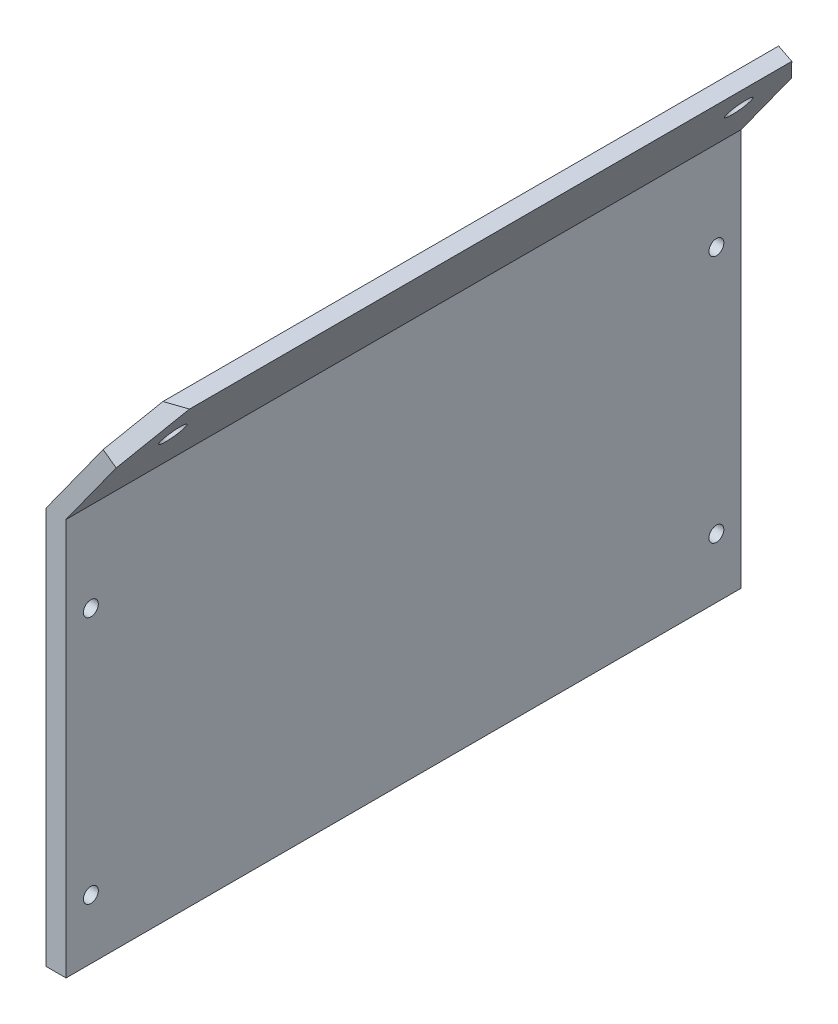
ISO-10303-21;
HEADER;
FILE_DESCRIPTION(('STEP AP214'),'2;1');
FILE_NAME('part.step','',(''),(''),'','','');
FILE_SCHEMA(('AUTOMOTIVE_DESIGN { 1 0 10303 214 1 1 1 1 }'));
ENDSEC;
DATA;
#1=APPLICATION_CONTEXT('core data for automotive mechanical design processes');
#2=APPLICATION_PROTOCOL_DEFINITION('international standard','automotive_design',2000,#1);
#3=PRODUCT_CONTEXT('',#1,'mechanical');
#4=PRODUCT('Part','Part','',(#3));
#5=PRODUCT_RELATED_PRODUCT_CATEGORY('part','',(#4));
#6=PRODUCT_DEFINITION_FORMATION('','',#4);
#7=PRODUCT_DEFINITION_CONTEXT('part definition',#1,'design');
#8=PRODUCT_DEFINITION('design','',#6,#7);
#9=PRODUCT_DEFINITION_SHAPE('','',#8);
#10=(LENGTH_UNIT() NAMED_UNIT(*) SI_UNIT(.MILLI.,.METRE.));
#11=(NAMED_UNIT(*) PLANE_ANGLE_UNIT() SI_UNIT($,.RADIAN.));
#12=(NAMED_UNIT(*) SI_UNIT($,.STERADIAN.) SOLID_ANGLE_UNIT());
#13=UNCERTAINTY_MEASURE_WITH_UNIT(LENGTH_MEASURE(1.E-05),#10,'distance_accuracy_value','');
#14=(GEOMETRIC_REPRESENTATION_CONTEXT(3) GLOBAL_UNCERTAINTY_ASSIGNED_CONTEXT((#13)) GLOBAL_UNIT_ASSIGNED_CONTEXT((#10,
#11,#12)) REPRESENTATION_CONTEXT('',''));
#15=CARTESIAN_POINT('',(0.,0.,0.));
#16=DIRECTION('',(0.,0.,1.));
#17=DIRECTION('',(1.,0.,0.));
#18=AXIS2_PLACEMENT_3D('',#15,#16,#17);
#19=CARTESIAN_POINT('',(-34.8648669846288,-21.5158492010153,136.));
#20=DIRECTION('',(0.,1.,0.));
#21=DIRECTION('',(0.,0.,1.));
#22=AXIS2_PLACEMENT_3D('',#19,#20,#21);
#23=PLANE('',#22);
#24=DIRECTION('',(1.,0.,0.));
#25=VECTOR('',#24,1.);
#26=CARTESIAN_POINT('',(-34.8648669846288,-21.5158492010153,0.));
#27=LINE('',#26,#25);
#28=CARTESIAN_POINT('',(-38.8648669846288,-21.5158492010153,0.));
#29=VERTEX_POINT('',#28);
#30=CARTESIAN_POINT('',(-34.8648669846288,-21.5158492010153,0.));
#31=VERTEX_POINT('',#30);
#32=EDGE_CURVE('E130',#29,#31,#27,.T.);
#33=ORIENTED_EDGE('',*,*,#32,.T.);
#34=DIRECTION('',(0.,0.,-1.));
#35=VECTOR('',#34,1.);
#36=CARTESIAN_POINT('',(-34.8648669846288,-21.5158492010153,136.));
#37=LINE('',#36,#35);
#38=CARTESIAN_POINT('',(-34.8648669846288,-21.5158492010153,136.));
#39=VERTEX_POINT('',#38);
#40=EDGE_CURVE('E119',#39,#31,#37,.T.);
#41=ORIENTED_EDGE('',*,*,#40,.F.);
#42=DIRECTION('',(1.,0.,0.));
#43=VECTOR('',#42,1.);
#44=CARTESIAN_POINT('',(-34.8648669846288,-21.5158492010153,136.));
#45=LINE('',#44,#43);
#46=CARTESIAN_POINT('',(-38.8648669846288,-21.5158492010153,136.));
#47=VERTEX_POINT('',#46);
#48=EDGE_CURVE('E180',#47,#39,#45,.T.);
#49=ORIENTED_EDGE('',*,*,#48,.F.);
#50=DIRECTION('',(0.,0.,-1.));
#51=VECTOR('',#50,1.);
#52=CARTESIAN_POINT('',(-38.8648669846288,-21.5158492010153,136.));
#53=LINE('',#52,#51);
#54=EDGE_CURVE('E165',#47,#29,#53,.T.);
#55=ORIENTED_EDGE('',*,*,#54,.T.);
#56=EDGE_LOOP('',(#33,#41,#49,#55));
#57=FACE_BOUND('',#56,.T.);
#58=ADVANCED_FACE('F32',(#57),#23,.F.);
#59=CARTESIAN_POINT('',(-34.8648669846288,58.4841507989847,136.));
#60=DIRECTION('',(-1.,0.,0.));
#61=DIRECTION('',(0.,-1.,0.));
#62=AXIS2_PLACEMENT_3D('',#59,#60,#61);
#63=PLANE('',#62);
#64=CARTESIAN_POINT('',(-34.8648669846288,-9.51584920101528,5.));
#65=DIRECTION('',(1.,0.,0.));
#66=DIRECTION('',(0.,1.,0.));
#67=AXIS2_PLACEMENT_3D('',#64,#65,#66);
#68=CIRCLE('',#67,1.5);
#69=CARTESIAN_POINT('',(-34.8648669846288,-8.01584920101528,5.));
#70=VERTEX_POINT('',#69);
#71=EDGE_CURVE('E143',#70,#70,#68,.T.);
#72=ORIENTED_EDGE('',*,*,#71,.F.);
#73=EDGE_LOOP('',(#72));
#74=FACE_BOUND('',#73,.T.);
#75=CARTESIAN_POINT('',(-34.8648669846288,40.4841507989847,5.));
#76=DIRECTION('',(1.,0.,0.));
#77=DIRECTION('',(0.,1.,0.));
#78=AXIS2_PLACEMENT_3D('',#75,#76,#77);
#79=CIRCLE('',#78,1.5);
#80=CARTESIAN_POINT('',(-34.8648669846288,41.9841507989847,5.));
#81=VERTEX_POINT('',#80);
#82=EDGE_CURVE('E139',#81,#81,#79,.T.);
#83=ORIENTED_EDGE('',*,*,#82,.F.);
#84=EDGE_LOOP('',(#83));
#85=FACE_BOUND('',#84,.T.);
#86=CARTESIAN_POINT('',(-34.8648669846288,-9.51584920101529,131.));
#87=DIRECTION('',(1.,0.,0.));
#88=DIRECTION('',(0.,1.,0.));
#89=AXIS2_PLACEMENT_3D('',#86,#87,#88);
#90=CIRCLE('',#89,1.5);
#91=CARTESIAN_POINT('',(-34.8648669846288,-8.01584920101529,131.));
#92=VERTEX_POINT('',#91);
#93=EDGE_CURVE('E135',#92,#92,#90,.T.);
#94=ORIENTED_EDGE('',*,*,#93,.F.);
#95=EDGE_LOOP('',(#94));
#96=FACE_BOUND('',#95,.T.);
#97=CARTESIAN_POINT('',(-34.8648669846288,40.4841507989847,131.));
#98=DIRECTION('',(1.,0.,0.));
#99=DIRECTION('',(0.,1.,0.));
#100=AXIS2_PLACEMENT_3D('',#97,#98,#99);
#101=CIRCLE('',#100,1.5);
#102=CARTESIAN_POINT('',(-34.8648669846288,41.9841507989847,131.));
#103=VERTEX_POINT('',#102);
#104=EDGE_CURVE('E131',#103,#103,#101,.T.);
#105=ORIENTED_EDGE('',*,*,#104,.F.);
#106=EDGE_LOOP('',(#105));
#107=FACE_BOUND('',#106,.T.);
#108=DIRECTION('',(0.,1.,0.));
#109=VECTOR('',#108,1.);
#110=CARTESIAN_POINT('',(-34.8648669846288,58.4841507989847,0.));
#111=LINE('',#110,#109);
#112=CARTESIAN_POINT('',(-34.8648669846288,58.4841507989847,0.));
#113=VERTEX_POINT('',#112);
#114=EDGE_CURVE('E173',#31,#113,#111,.T.);
#115=ORIENTED_EDGE('',*,*,#114,.T.);
#116=DIRECTION('',(0.,0.,-1.));
#117=VECTOR('',#116,1.);
#118=CARTESIAN_POINT('',(-34.8648669846288,58.4841507989847,136.));
#119=LINE('',#118,#117);
#120=CARTESIAN_POINT('',(-34.8648669846288,58.4841507989847,136.));
#121=VERTEX_POINT('',#120);
#122=EDGE_CURVE('E116',#121,#113,#119,.T.);
#123=ORIENTED_EDGE('',*,*,#122,.F.);
#124=DIRECTION('',(0.,1.,0.));
#125=VECTOR('',#124,1.);
#126=CARTESIAN_POINT('',(-34.8648669846288,58.4841507989847,136.));
#127=LINE('',#126,#125);
#128=EDGE_CURVE('E167',#39,#121,#127,.T.);
#129=ORIENTED_EDGE('',*,*,#128,.F.);
#130=ORIENTED_EDGE('',*,*,#40,.T.);
#131=EDGE_LOOP('',(#115,#123,#129,#130));
#132=FACE_BOUND('',#131,.T.);
#133=ADVANCED_FACE('F214',(#74,#85,#96,#107,#132),#63,.F.);
#134=CARTESIAN_POINT('',(-17.3357252092765,82.8301810425296,136.));
#135=DIRECTION('',(-0.811534341451495,0.584304725845076,0.));
#136=DIRECTION('',(-0.584304725845076,-0.811534341451495,0.));
#137=AXIS2_PLACEMENT_3D('',#134,#135,#136);
#138=PLANE('',#137);
#139=CARTESIAN_POINT('',(-24.3473819194174,73.0917689451116,11.));
#140=DIRECTION('',(0.811534341451494,-0.584304725845076,0.));
#141=DIRECTION('',(0.584304725845076,0.811534341451494,0.));
#142=AXIS2_PLACEMENT_3D('',#139,#140,#141);
#143=CIRCLE('',#142,2.5);
#144=CARTESIAN_POINT('',(-22.8866201048047,75.1206047987404,11.));
#145=VERTEX_POINT('',#144);
#146=EDGE_CURVE('E150',#145,#145,#143,.T.);
#147=ORIENTED_EDGE('',*,*,#146,.F.);
#148=EDGE_LOOP('',(#147));
#149=FACE_BOUND('',#148,.T.);
#150=CARTESIAN_POINT('',(-24.3473819194174,73.0917689451116,125.));
#151=DIRECTION('',(0.811534341451494,-0.584304725845076,0.));
#152=DIRECTION('',(0.584304725845076,0.811534341451494,0.));
#153=AXIS2_PLACEMENT_3D('',#150,#151,#152);
#154=CIRCLE('',#153,2.49999999999999);
#155=CARTESIAN_POINT('',(-22.8866201048047,75.1206047987404,125.));
#156=VERTEX_POINT('',#155);
#157=EDGE_CURVE('E147',#156,#156,#154,.T.);
#158=ORIENTED_EDGE('',*,*,#157,.F.);
#159=EDGE_LOOP('',(#158));
#160=FACE_BOUND('',#159,.T.);
#161=DIRECTION('',(0.584304725845076,0.811534341451495,0.));
#162=VECTOR('',#161,1.);
#163=CARTESIAN_POINT('',(-17.3357252092765,82.8301810425296,0.));
#164=LINE('',#163,#162);
#165=CARTESIAN_POINT('',(-24.7633233609447,72.514072498546,0.));
#166=VERTEX_POINT('',#165);
#167=EDGE_CURVE('E111',#113,#166,#164,.T.);
#168=ORIENTED_EDGE('',*,*,#167,.T.);
#169=DIRECTION('',(-0.506022736133139,-0.702809355740471,-0.499999999999996));
#170=VECTOR('',#169,1.);
#171=CARTESIAN_POINT('',(-24.7633233609447,72.514072498546,0.));
#172=LINE('',#171,#170);
#173=CARTESIAN_POINT('',(-17.3357252092765,82.8301810425296,7.33919409276687));
#174=VERTEX_POINT('',#173);
#175=EDGE_CURVE('E45',#174,#166,#172,.T.);
#176=ORIENTED_EDGE('',*,*,#175,.F.);
#177=DIRECTION('',(0.,0.,-1.));
#178=VECTOR('',#177,1.);
#179=CARTESIAN_POINT('',(-17.3357252092765,82.8301810425296,136.));
#180=LINE('',#179,#178);
#181=CARTESIAN_POINT('',(-17.3357252092765,82.8301810425296,128.660805907233));
#182=VERTEX_POINT('',#181);
#183=EDGE_CURVE('E108',#182,#174,#180,.T.);
#184=ORIENTED_EDGE('',*,*,#183,.F.);
#185=DIRECTION('',(0.506022736133139,0.702809355740472,-0.499999999999994));
#186=VECTOR('',#185,1.);
#187=CARTESIAN_POINT('',(-24.7633233609447,72.514072498546,136.));
#188=LINE('',#187,#186);
#189=CARTESIAN_POINT('',(-24.7633233609447,72.514072498546,136.));
#190=VERTEX_POINT('',#189);
#191=EDGE_CURVE('E101',#190,#182,#188,.T.);
#192=ORIENTED_EDGE('',*,*,#191,.F.);
#193=DIRECTION('',(0.584304725845076,0.811534341451495,0.));
#194=VECTOR('',#193,1.);
#195=CARTESIAN_POINT('',(-17.3357252092765,82.8301810425296,136.));
#196=LINE('',#195,#194);
#197=EDGE_CURVE('E158',#121,#190,#196,.T.);
#198=ORIENTED_EDGE('',*,*,#197,.F.);
#199=ORIENTED_EDGE('',*,*,#122,.T.);
#200=EDGE_LOOP('',(#168,#176,#184,#192,#198,#199));
#201=FACE_BOUND('',#200,.T.);
#202=ADVANCED_FACE('F106',(#149,#160,#201),#138,.F.);
#203=CARTESIAN_POINT('',(-21.3357252092765,82.8301810425296,136.));
#204=DIRECTION('',(0.,-1.,0.));
#205=DIRECTION('',(0.,0.,-1.));
#206=AXIS2_PLACEMENT_3D('',#203,#204,#205);
#207=PLANE('',#206);
#208=ORIENTED_EDGE('',*,*,#183,.T.);
#209=DIRECTION('',(-0.947535767279718,0.,-0.319649761028593));
#210=VECTOR('',#209,1.);
#211=CARTESIAN_POINT('',(18.0417097281692,82.8301810425296,19.2737183757123));
#212=LINE('',#211,#210);
#213=CARTESIAN_POINT('',(-21.3357252092765,82.8301810425296,5.98980012974519));
#214=VERTEX_POINT('',#213);
#215=EDGE_CURVE('E93',#174,#214,#212,.T.);
#216=ORIENTED_EDGE('',*,*,#215,.T.);
#217=DIRECTION('',(0.,0.,-1.));
#218=VECTOR('',#217,1.);
#219=CARTESIAN_POINT('',(-21.3357252092765,82.8301810425296,136.));
#220=LINE('',#219,#218);
#221=CARTESIAN_POINT('',(-21.3357252092765,82.8301810425296,130.010199870255));
#222=VERTEX_POINT('',#221);
#223=EDGE_CURVE('E117',#222,#214,#220,.T.);
#224=ORIENTED_EDGE('',*,*,#223,.F.);
#225=DIRECTION('',(0.947535767279718,0.,-0.319649761028592));
#226=VECTOR('',#225,1.);
#227=CARTESIAN_POINT('',(-23.1499133663036,82.8301810425296,130.622213506974));
#228=LINE('',#227,#226);
#229=EDGE_CURVE('E115',#222,#182,#228,.T.);
#230=ORIENTED_EDGE('',*,*,#229,.T.);
#231=EDGE_LOOP('',(#208,#216,#224,#230));
#232=FACE_BOUND('',#231,.T.);
#233=ADVANCED_FACE('F114',(#232),#207,.F.);
#234=CARTESIAN_POINT('',(-38.8648669846288,58.4841507989847,136.));
#235=DIRECTION('',(0.811534341451495,-0.584304725845076,0.));
#236=DIRECTION('',(0.584304725845076,0.811534341451495,0.));
#237=AXIS2_PLACEMENT_3D('',#234,#235,#236);
#238=PLANE('',#237);
#239=CARTESIAN_POINT('',(-26.9817338688379,74.9885023486944,11.));
#240=DIRECTION('',(0.811534341451495,-0.584304725845076,0.));
#241=DIRECTION('',(0.584304725845076,0.811534341451495,0.));
#242=AXIS2_PLACEMENT_3D('',#239,#240,#241);
#243=CIRCLE('',#242,2.5);
#244=CARTESIAN_POINT('',(-25.5209720542252,77.0173382023231,11.));
#245=VERTEX_POINT('',#244);
#246=EDGE_CURVE('E148',#245,#245,#243,.T.);
#247=ORIENTED_EDGE('',*,*,#246,.T.);
#248=EDGE_LOOP('',(#247));
#249=FACE_BOUND('',#248,.T.);
#250=CARTESIAN_POINT('',(-26.9817338688379,74.9885023486944,125.));
#251=DIRECTION('',(0.811534341451495,-0.584304725845076,0.));
#252=DIRECTION('',(0.584304725845076,0.811534341451495,0.));
#253=AXIS2_PLACEMENT_3D('',#250,#251,#252);
#254=CIRCLE('',#253,2.49999999999999);
#255=CARTESIAN_POINT('',(-25.5209720542252,77.0173382023231,125.));
#256=VERTEX_POINT('',#255);
#257=EDGE_CURVE('E144',#256,#256,#254,.T.);
#258=ORIENTED_EDGE('',*,*,#257,.T.);
#259=EDGE_LOOP('',(#258));
#260=FACE_BOUND('',#259,.T.);
#261=ORIENTED_EDGE('',*,*,#223,.T.);
#262=DIRECTION('',(-0.506022736133139,-0.702809355740471,-0.499999999999996));
#263=VECTOR('',#262,1.);
#264=CARTESIAN_POINT('',(-1.58852300900975,110.256850765122,25.5019690405419));
#265=LINE('',#264,#263);
#266=CARTESIAN_POINT('',(-27.3976753103651,74.4108059021287,0.));
#267=VERTEX_POINT('',#266);
#268=EDGE_CURVE('E96',#214,#267,#265,.T.);
#269=ORIENTED_EDGE('',*,*,#268,.T.);
#270=DIRECTION('',(-0.584304725845076,-0.811534341451495,0.));
#271=VECTOR('',#270,1.);
#272=CARTESIAN_POINT('',(-38.8648669846288,58.4841507989847,0.));
#273=LINE('',#272,#271);
#274=CARTESIAN_POINT('',(-38.8648669846288,58.4841507989847,0.));
#275=VERTEX_POINT('',#274);
#276=EDGE_CURVE('E176',#267,#275,#273,.T.);
#277=ORIENTED_EDGE('',*,*,#276,.T.);
#278=DIRECTION('',(0.,0.,-1.));
#279=VECTOR('',#278,1.);
#280=CARTESIAN_POINT('',(-38.8648669846288,58.4841507989847,136.));
#281=LINE('',#280,#279);
#282=CARTESIAN_POINT('',(-38.8648669846288,58.4841507989847,136.));
#283=VERTEX_POINT('',#282);
#284=EDGE_CURVE('E121',#283,#275,#281,.T.);
#285=ORIENTED_EDGE('',*,*,#284,.F.);
#286=DIRECTION('',(-0.584304725845076,-0.811534341451495,0.));
#287=VECTOR('',#286,1.);
#288=CARTESIAN_POINT('',(-38.8648669846288,58.4841507989847,136.));
#289=LINE('',#288,#287);
#290=CARTESIAN_POINT('',(-27.3976753103651,74.4108059021287,136.));
#291=VERTEX_POINT('',#290);
#292=EDGE_CURVE('E155',#291,#283,#289,.T.);
#293=ORIENTED_EDGE('',*,*,#292,.F.);
#294=DIRECTION('',(0.506022736133139,0.702809355740472,-0.499999999999994));
#295=VECTOR('',#294,1.);
#296=CARTESIAN_POINT('',(-35.9980690660629,62.4658145747706,144.498030959458));
#297=LINE('',#296,#295);
#298=EDGE_CURVE('E53',#291,#222,#297,.T.);
#299=ORIENTED_EDGE('',*,*,#298,.T.);
#300=EDGE_LOOP('',(#261,#269,#277,#285,#293,#299));
#301=FACE_BOUND('',#300,.T.);
#302=ADVANCED_FACE('F160',(#249,#260,#301),#238,.F.);
#303=CARTESIAN_POINT('',(-38.8648669846288,-21.5158492010153,136.));
#304=DIRECTION('',(1.,0.,0.));
#305=DIRECTION('',(0.,0.,-1.));
#306=AXIS2_PLACEMENT_3D('',#303,#304,#305);
#307=PLANE('',#306);
#308=CARTESIAN_POINT('',(-38.8648669846288,-9.51584920101528,5.));
#309=DIRECTION('',(1.,0.,0.));
#310=DIRECTION('',(0.,0.,-1.));
#311=AXIS2_PLACEMENT_3D('',#308,#309,#310);
#312=CIRCLE('',#311,1.5);
#313=CARTESIAN_POINT('',(-38.8648669846288,-9.51584920101528,3.5));
#314=VERTEX_POINT('',#313);
#315=EDGE_CURVE('E140',#314,#314,#312,.T.);
#316=ORIENTED_EDGE('',*,*,#315,.T.);
#317=EDGE_LOOP('',(#316));
#318=FACE_BOUND('',#317,.T.);
#319=CARTESIAN_POINT('',(-38.8648669846288,40.4841507989847,5.));
#320=DIRECTION('',(1.,0.,0.));
#321=DIRECTION('',(0.,0.,-1.));
#322=AXIS2_PLACEMENT_3D('',#319,#320,#321);
#323=CIRCLE('',#322,1.5);
#324=CARTESIAN_POINT('',(-38.8648669846288,40.4841507989847,3.5));
#325=VERTEX_POINT('',#324);
#326=EDGE_CURVE('E136',#325,#325,#323,.T.);
#327=ORIENTED_EDGE('',*,*,#326,.T.);
#328=EDGE_LOOP('',(#327));
#329=FACE_BOUND('',#328,.T.);
#330=CARTESIAN_POINT('',(-38.8648669846288,-9.51584920101529,131.));
#331=DIRECTION('',(1.,0.,0.));
#332=DIRECTION('',(0.,0.,-1.));
#333=AXIS2_PLACEMENT_3D('',#330,#331,#332);
#334=CIRCLE('',#333,1.5);
#335=CARTESIAN_POINT('',(-38.8648669846288,-9.51584920101529,129.5));
#336=VERTEX_POINT('',#335);
#337=EDGE_CURVE('E132',#336,#336,#334,.T.);
#338=ORIENTED_EDGE('',*,*,#337,.T.);
#339=EDGE_LOOP('',(#338));
#340=FACE_BOUND('',#339,.T.);
#341=CARTESIAN_POINT('',(-38.8648669846288,40.4841507989847,131.));
#342=DIRECTION('',(1.,0.,0.));
#343=DIRECTION('',(0.,0.,-1.));
#344=AXIS2_PLACEMENT_3D('',#341,#342,#343);
#345=CIRCLE('',#344,1.5);
#346=CARTESIAN_POINT('',(-38.8648669846288,40.4841507989847,129.5));
#347=VERTEX_POINT('',#346);
#348=EDGE_CURVE('E127',#347,#347,#345,.T.);
#349=ORIENTED_EDGE('',*,*,#348,.T.);
#350=EDGE_LOOP('',(#349));
#351=FACE_BOUND('',#350,.T.);
#352=DIRECTION('',(0.,-1.,0.));
#353=VECTOR('',#352,1.);
#354=CARTESIAN_POINT('',(-38.8648669846288,-21.5158492010153,0.));
#355=LINE('',#354,#353);
#356=EDGE_CURVE('E178',#275,#29,#355,.T.);
#357=ORIENTED_EDGE('',*,*,#356,.T.);
#358=ORIENTED_EDGE('',*,*,#54,.F.);
#359=DIRECTION('',(0.,-1.,0.));
#360=VECTOR('',#359,1.);
#361=CARTESIAN_POINT('',(-38.8648669846288,-21.5158492010153,136.));
#362=LINE('',#361,#360);
#363=EDGE_CURVE('E163',#283,#47,#362,.T.);
#364=ORIENTED_EDGE('',*,*,#363,.F.);
#365=ORIENTED_EDGE('',*,*,#284,.T.);
#366=EDGE_LOOP('',(#357,#358,#364,#365));
#367=FACE_BOUND('',#366,.T.);
#368=ADVANCED_FACE('F184',(#318,#329,#340,#351,#367),#307,.F.);
#369=CARTESIAN_POINT('',(-38.8648669846288,-21.5158492010153,136.));
#370=DIRECTION('',(0.,0.,-1.));
#371=DIRECTION('',(-1.,0.,0.));
#372=AXIS2_PLACEMENT_3D('',#369,#370,#371);
#373=PLANE('',#372);
#374=ORIENTED_EDGE('',*,*,#197,.T.);
#375=DIRECTION('',(-0.811534341451494,0.584304725845076,0.));
#376=VECTOR('',#375,1.);
#377=CARTESIAN_POINT('',(10.5369927612892,47.0978448905375,136.));
#378=LINE('',#377,#376);
#379=EDGE_CURVE('E39',#190,#291,#378,.T.);
#380=ORIENTED_EDGE('',*,*,#379,.T.);
#381=ORIENTED_EDGE('',*,*,#292,.T.);
#382=ORIENTED_EDGE('',*,*,#363,.T.);
#383=ORIENTED_EDGE('',*,*,#48,.T.);
#384=ORIENTED_EDGE('',*,*,#128,.T.);
#385=EDGE_LOOP('',(#374,#380,#381,#382,#383,#384));
#386=FACE_BOUND('',#385,.T.);
#387=ADVANCED_FACE('F154',(#386),#373,.F.);
#388=CARTESIAN_POINT('',(-38.8648669846288,-21.5158492010153,0.));
#389=DIRECTION('',(0.,0.,-1.));
#390=DIRECTION('',(-1.,0.,0.));
#391=AXIS2_PLACEMENT_3D('',#388,#389,#390);
#392=PLANE('',#391);
#393=DIRECTION('',(-0.811534341451495,0.584304725845076,0.));
#394=VECTOR('',#393,1.);
#395=CARTESIAN_POINT('',(10.5369927612893,47.0978448905376,0.));
#396=LINE('',#395,#394);
#397=EDGE_CURVE('E11',#166,#267,#396,.T.);
#398=ORIENTED_EDGE('',*,*,#397,.F.);
#399=ORIENTED_EDGE('',*,*,#167,.F.);
#400=ORIENTED_EDGE('',*,*,#114,.F.);
#401=ORIENTED_EDGE('',*,*,#32,.F.);
#402=ORIENTED_EDGE('',*,*,#356,.F.);
#403=ORIENTED_EDGE('',*,*,#276,.F.);
#404=EDGE_LOOP('',(#398,#399,#400,#401,#402,#403));
#405=FACE_BOUND('',#404,.T.);
#406=ADVANCED_FACE('F189',(#405),#392,.T.);
#407=CARTESIAN_POINT('',(-170.864866984629,40.4841507989847,131.));
#408=DIRECTION('',(1.,0.,0.));
#409=DIRECTION('',(0.,1.,0.));
#410=AXIS2_PLACEMENT_3D('',#407,#408,#409);
#411=CYLINDRICAL_SURFACE('',#410,1.5);
#412=ORIENTED_EDGE('',*,*,#104,.T.);
#413=EDGE_LOOP('',(#412));
#414=FACE_BOUND('',#413,.T.);
#415=ORIENTED_EDGE('',*,*,#348,.F.);
#416=EDGE_LOOP('',(#415));
#417=FACE_BOUND('',#416,.T.);
#418=ADVANCED_FACE('F236',(#414,#417),#411,.F.);
#419=CARTESIAN_POINT('',(-170.864866984629,-9.51584920101531,131.));
#420=DIRECTION('',(1.,0.,0.));
#421=DIRECTION('',(0.,1.,0.));
#422=AXIS2_PLACEMENT_3D('',#419,#420,#421);
#423=CYLINDRICAL_SURFACE('',#422,1.5);
#424=ORIENTED_EDGE('',*,*,#93,.T.);
#425=EDGE_LOOP('',(#424));
#426=FACE_BOUND('',#425,.T.);
#427=ORIENTED_EDGE('',*,*,#337,.F.);
#428=EDGE_LOOP('',(#427));
#429=FACE_BOUND('',#428,.T.);
#430=ADVANCED_FACE('F241',(#426,#429),#423,.F.);
#431=CARTESIAN_POINT('',(-170.864866984629,40.4841507989847,5.));
#432=DIRECTION('',(1.,0.,0.));
#433=DIRECTION('',(0.,1.,0.));
#434=AXIS2_PLACEMENT_3D('',#431,#432,#433);
#435=CYLINDRICAL_SURFACE('',#434,1.5);
#436=ORIENTED_EDGE('',*,*,#82,.T.);
#437=EDGE_LOOP('',(#436));
#438=FACE_BOUND('',#437,.T.);
#439=ORIENTED_EDGE('',*,*,#326,.F.);
#440=EDGE_LOOP('',(#439));
#441=FACE_BOUND('',#440,.T.);
#442=ADVANCED_FACE('F245',(#438,#441),#435,.F.);
#443=CARTESIAN_POINT('',(-170.864866984629,-9.51584920101529,5.));
#444=DIRECTION('',(1.,0.,0.));
#445=DIRECTION('',(0.,1.,0.));
#446=AXIS2_PLACEMENT_3D('',#443,#444,#445);
#447=CYLINDRICAL_SURFACE('',#446,1.5);
#448=ORIENTED_EDGE('',*,*,#71,.T.);
#449=EDGE_LOOP('',(#448));
#450=FACE_BOUND('',#449,.T.);
#451=ORIENTED_EDGE('',*,*,#315,.F.);
#452=EDGE_LOOP('',(#451));
#453=FACE_BOUND('',#452,.T.);
#454=ADVANCED_FACE('F249',(#450,#453),#447,.F.);
#455=CARTESIAN_POINT('',(-134.716052356821,152.557211660042,125.));
#456=DIRECTION('',(0.811534341451494,-0.584304725845076,0.));
#457=DIRECTION('',(0.584304725845076,0.811534341451494,0.));
#458=AXIS2_PLACEMENT_3D('',#455,#456,#457);
#459=CYLINDRICAL_SURFACE('',#458,2.49999999999999);
#460=ORIENTED_EDGE('',*,*,#157,.T.);
#461=EDGE_LOOP('',(#460));
#462=FACE_BOUND('',#461,.T.);
#463=ORIENTED_EDGE('',*,*,#257,.F.);
#464=EDGE_LOOP('',(#463));
#465=FACE_BOUND('',#464,.T.);
#466=ADVANCED_FACE('F253',(#462,#465),#459,.F.);
#467=CARTESIAN_POINT('',(-134.716052356821,152.557211660042,11.));
#468=DIRECTION('',(0.811534341451494,-0.584304725845076,0.));
#469=DIRECTION('',(0.584304725845076,0.811534341451494,0.));
#470=AXIS2_PLACEMENT_3D('',#467,#468,#469);
#471=CYLINDRICAL_SURFACE('',#470,2.5);
#472=ORIENTED_EDGE('',*,*,#146,.T.);
#473=EDGE_LOOP('',(#472));
#474=FACE_BOUND('',#473,.T.);
#475=ORIENTED_EDGE('',*,*,#246,.F.);
#476=EDGE_LOOP('',(#475));
#477=FACE_BOUND('',#476,.T.);
#478=ADVANCED_FACE('F257',(#474,#477),#471,.F.);
#479=CARTESIAN_POINT('',(-135.131993798348,151.979515213476,136.));
#480=DIRECTION('',(-0.292152362922535,-0.405767170725743,-0.866025403784442));
#481=DIRECTION('',(0.,0.905532152528378,-0.424277645813826));
#482=AXIS2_PLACEMENT_3D('',#479,#480,#481);
#483=PLANE('',#482);
#484=ORIENTED_EDGE('',*,*,#298,.F.);
#485=ORIENTED_EDGE('',*,*,#379,.F.);
#486=ORIENTED_EDGE('',*,*,#191,.T.);
#487=ORIENTED_EDGE('',*,*,#229,.F.);
#488=EDGE_LOOP('',(#484,#485,#486,#487));
#489=FACE_BOUND('',#488,.T.);
#490=ADVANCED_FACE('F211',(#489),#483,.F.);
#491=CARTESIAN_POINT('',(-135.131993798348,151.979515213476,0.));
#492=DIRECTION('',(-0.292152362922536,-0.405767170725744,0.866025403784441));
#493=DIRECTION('',(0.,-0.905532152528377,-0.424277645813828));
#494=AXIS2_PLACEMENT_3D('',#491,#492,#493);
#495=PLANE('',#494);
#496=ORIENTED_EDGE('',*,*,#175,.T.);
#497=ORIENTED_EDGE('',*,*,#397,.T.);
#498=ORIENTED_EDGE('',*,*,#268,.F.);
#499=ORIENTED_EDGE('',*,*,#215,.F.);
#500=EDGE_LOOP('',(#496,#497,#498,#499));
#501=FACE_BOUND('',#500,.T.);
#502=ADVANCED_FACE('F94',(#501),#495,.F.);
#503=CLOSED_SHELL('',(#58,#133,#202,#233,#302,#368,#387,#406,#418,#430,#442,#454,#466,#478,#490,#502));
#504=MANIFOLD_SOLID_BREP('B2',#503);
#505=ADVANCED_BREP_SHAPE_REPRESENTATION('',(#18,#504),#14);
#506=SHAPE_DEFINITION_REPRESENTATION(#9,#505);
ENDSEC;
END-ISO-10303-21;
